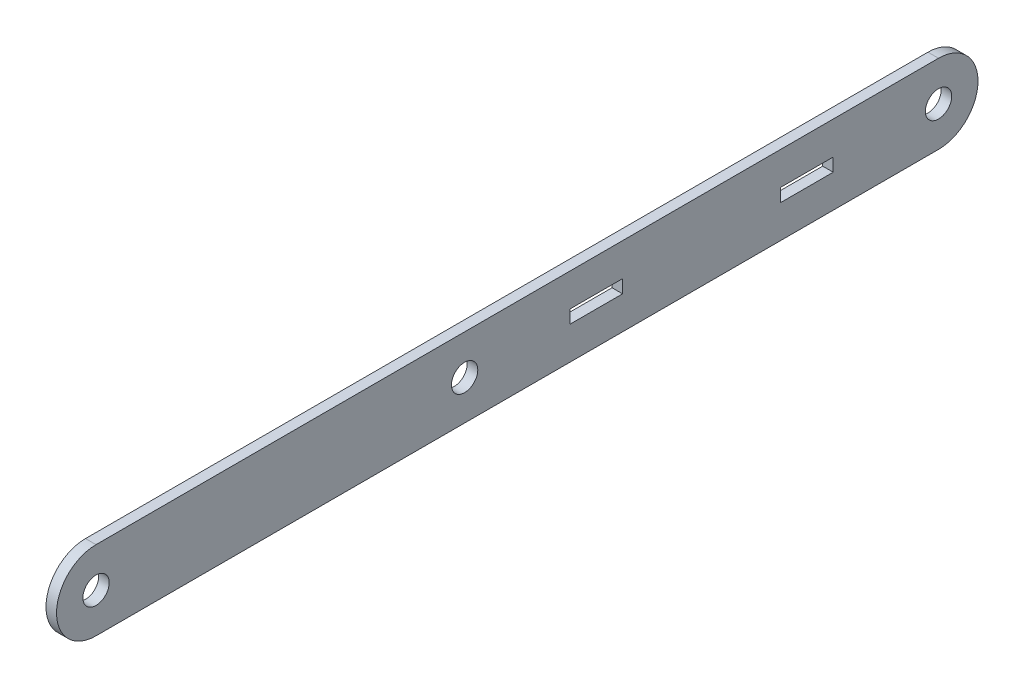
ISO-10303-21;
HEADER;
FILE_DESCRIPTION(('STEP AP214'),'2;1');
FILE_NAME('part.step','',(''),(''),'','','');
FILE_SCHEMA(('AUTOMOTIVE_DESIGN { 1 0 10303 214 1 1 1 1 }'));
ENDSEC;
DATA;
#1=APPLICATION_CONTEXT('core data for automotive mechanical design processes');
#2=APPLICATION_PROTOCOL_DEFINITION('international standard','automotive_design',2000,#1);
#3=PRODUCT_CONTEXT('',#1,'mechanical');
#4=PRODUCT('Part','Part','',(#3));
#5=PRODUCT_RELATED_PRODUCT_CATEGORY('part','',(#4));
#6=PRODUCT_DEFINITION_FORMATION('','',#4);
#7=PRODUCT_DEFINITION_CONTEXT('part definition',#1,'design');
#8=PRODUCT_DEFINITION('design','',#6,#7);
#9=PRODUCT_DEFINITION_SHAPE('','',#8);
#10=(LENGTH_UNIT() NAMED_UNIT(*) SI_UNIT(.MILLI.,.METRE.));
#11=(NAMED_UNIT(*) PLANE_ANGLE_UNIT() SI_UNIT($,.RADIAN.));
#12=(NAMED_UNIT(*) SI_UNIT($,.STERADIAN.) SOLID_ANGLE_UNIT());
#13=UNCERTAINTY_MEASURE_WITH_UNIT(LENGTH_MEASURE(1.E-05),#10,'distance_accuracy_value','');
#14=(GEOMETRIC_REPRESENTATION_CONTEXT(3) GLOBAL_UNCERTAINTY_ASSIGNED_CONTEXT((#13)) GLOBAL_UNIT_ASSIGNED_CONTEXT((#10,
#11,#12)) REPRESENTATION_CONTEXT('',''));
#15=CARTESIAN_POINT('',(0.,0.,0.));
#16=DIRECTION('',(0.,0.,1.));
#17=DIRECTION('',(1.,0.,0.));
#18=AXIS2_PLACEMENT_3D('',#15,#16,#17);
#19=CARTESIAN_POINT('',(2.,0.,80.));
#20=DIRECTION('',(1.,0.,0.));
#21=DIRECTION('',(0.,0.,-1.));
#22=AXIS2_PLACEMENT_3D('',#19,#20,#21);
#23=PLANE('',#22);
#24=CARTESIAN_POINT('',(2.,0.,10.));
#25=DIRECTION('',(1.,0.,0.));
#26=DIRECTION('',(0.,0.,-1.));
#27=AXIS2_PLACEMENT_3D('',#24,#25,#26);
#28=CIRCLE('',#27,2.5);
#29=CARTESIAN_POINT('',(2.,0.,7.50000000000002));
#30=VERTEX_POINT('',#29);
#31=EDGE_CURVE('E160',#30,#30,#28,.T.);
#32=ORIENTED_EDGE('',*,*,#31,.F.);
#33=EDGE_LOOP('',(#32));
#34=FACE_BOUND('',#33,.T.);
#35=CARTESIAN_POINT('',(2.,0.,-80.));
#36=DIRECTION('',(1.,0.,0.));
#37=DIRECTION('',(0.,0.,-1.));
#38=AXIS2_PLACEMENT_3D('',#35,#36,#37);
#39=CIRCLE('',#38,2.50000000000001);
#40=CARTESIAN_POINT('',(2.,0.,-82.5));
#41=VERTEX_POINT('',#40);
#42=EDGE_CURVE('E197',#41,#41,#39,.T.);
#43=ORIENTED_EDGE('',*,*,#42,.F.);
#44=EDGE_LOOP('',(#43));
#45=FACE_BOUND('',#44,.T.);
#46=CARTESIAN_POINT('',(2.,0.,80.));
#47=DIRECTION('',(1.,0.,0.));
#48=DIRECTION('',(0.,0.,-1.));
#49=AXIS2_PLACEMENT_3D('',#46,#47,#48);
#50=CIRCLE('',#49,7.5);
#51=CARTESIAN_POINT('',(2.,7.49999999999999,80.));
#52=VERTEX_POINT('',#51);
#53=CARTESIAN_POINT('',(2.,-7.50000000000001,80.));
#54=VERTEX_POINT('',#53);
#55=EDGE_CURVE('E209',#52,#54,#50,.T.);
#56=ORIENTED_EDGE('',*,*,#55,.T.);
#57=DIRECTION('',(0.,0.,-1.));
#58=VECTOR('',#57,1.);
#59=CARTESIAN_POINT('',(2.,-7.49999999999998,-80.));
#60=LINE('',#59,#58);
#61=CARTESIAN_POINT('',(2.,-7.49999999999998,-80.));
#62=VERTEX_POINT('',#61);
#63=EDGE_CURVE('E212',#54,#62,#60,.T.);
#64=ORIENTED_EDGE('',*,*,#63,.T.);
#65=CARTESIAN_POINT('',(2.,0.,-80.));
#66=DIRECTION('',(1.,0.,0.));
#67=DIRECTION('',(0.,0.,1.));
#68=AXIS2_PLACEMENT_3D('',#65,#66,#67);
#69=CIRCLE('',#68,7.5);
#70=CARTESIAN_POINT('',(2.,7.50000000000002,-80.));
#71=VERTEX_POINT('',#70);
#72=EDGE_CURVE('E215',#62,#71,#69,.T.);
#73=ORIENTED_EDGE('',*,*,#72,.T.);
#74=DIRECTION('',(0.,0.,1.));
#75=VECTOR('',#74,1.);
#76=CARTESIAN_POINT('',(2.,7.50000000000002,-80.));
#77=LINE('',#76,#75);
#78=EDGE_CURVE('E217',#71,#52,#77,.T.);
#79=ORIENTED_EDGE('',*,*,#78,.T.);
#80=EDGE_LOOP('',(#56,#64,#73,#79));
#81=FACE_BOUND('',#80,.T.);
#82=CARTESIAN_POINT('',(2.,0.,80.));
#83=DIRECTION('',(1.,0.,0.));
#84=DIRECTION('',(0.,0.,-1.));
#85=AXIS2_PLACEMENT_3D('',#82,#83,#84);
#86=CIRCLE('',#85,2.50000000000001);
#87=CARTESIAN_POINT('',(2.,0.,77.5));
#88=VERTEX_POINT('',#87);
#89=EDGE_CURVE('E203',#88,#88,#86,.T.);
#90=ORIENTED_EDGE('',*,*,#89,.F.);
#91=EDGE_LOOP('',(#90));
#92=FACE_BOUND('',#91,.T.);
#93=DIRECTION('',(0.,0.,-1.));
#94=VECTOR('',#93,1.);
#95=CARTESIAN_POINT('',(2.,-1.25000000000001,-9.99999999999998));
#96=LINE('',#95,#94);
#97=CARTESIAN_POINT('',(2.,-1.25000000000001,-9.99999999999998));
#98=VERTEX_POINT('',#97);
#99=CARTESIAN_POINT('',(2.,-1.25000000000001,-20.));
#100=VERTEX_POINT('',#99);
#101=EDGE_CURVE('E168',#98,#100,#96,.T.);
#102=ORIENTED_EDGE('',*,*,#101,.F.);
#103=DIRECTION('',(0.,-1.,0.));
#104=VECTOR('',#103,1.);
#105=CARTESIAN_POINT('',(2.,-1.25000000000001,-9.99999999999998));
#106=LINE('',#105,#104);
#107=CARTESIAN_POINT('',(2.,1.24999999999999,-9.99999999999998));
#108=VERTEX_POINT('',#107);
#109=EDGE_CURVE('E166',#108,#98,#106,.T.);
#110=ORIENTED_EDGE('',*,*,#109,.F.);
#111=DIRECTION('',(0.,0.,1.));
#112=VECTOR('',#111,1.);
#113=CARTESIAN_POINT('',(2.,1.24999999999999,-9.99999999999998));
#114=LINE('',#113,#112);
#115=CARTESIAN_POINT('',(2.,1.24999999999999,-20.));
#116=VERTEX_POINT('',#115);
#117=EDGE_CURVE('E174',#116,#108,#114,.T.);
#118=ORIENTED_EDGE('',*,*,#117,.F.);
#119=DIRECTION('',(0.,1.,0.));
#120=VECTOR('',#119,1.);
#121=CARTESIAN_POINT('',(2.,-1.25000000000001,-20.));
#122=LINE('',#121,#120);
#123=EDGE_CURVE('E171',#100,#116,#122,.T.);
#124=ORIENTED_EDGE('',*,*,#123,.F.);
#125=EDGE_LOOP('',(#102,#110,#118,#124));
#126=FACE_BOUND('',#125,.T.);
#127=DIRECTION('',(0.,0.,1.));
#128=VECTOR('',#127,1.);
#129=CARTESIAN_POINT('',(2.,1.24999999999999,-60.));
#130=LINE('',#129,#128);
#131=CARTESIAN_POINT('',(2.,1.24999999999999,-60.));
#132=VERTEX_POINT('',#131);
#133=CARTESIAN_POINT('',(2.,1.24999999999999,-50.));
#134=VERTEX_POINT('',#133);
#135=EDGE_CURVE('E132',#132,#134,#130,.T.);
#136=ORIENTED_EDGE('',*,*,#135,.F.);
#137=DIRECTION('',(0.,1.,0.));
#138=VECTOR('',#137,1.);
#139=CARTESIAN_POINT('',(2.,1.24999999999999,-60.));
#140=LINE('',#139,#138);
#141=CARTESIAN_POINT('',(2.,-1.25000000000001,-60.));
#142=VERTEX_POINT('',#141);
#143=EDGE_CURVE('E124',#142,#132,#140,.T.);
#144=ORIENTED_EDGE('',*,*,#143,.F.);
#145=DIRECTION('',(0.,0.,-1.));
#146=VECTOR('',#145,1.);
#147=CARTESIAN_POINT('',(2.,-1.25000000000001,-60.));
#148=LINE('',#147,#146);
#149=CARTESIAN_POINT('',(2.,-1.25000000000001,-50.));
#150=VERTEX_POINT('',#149);
#151=EDGE_CURVE('E146',#150,#142,#148,.T.);
#152=ORIENTED_EDGE('',*,*,#151,.F.);
#153=DIRECTION('',(0.,-1.,0.));
#154=VECTOR('',#153,1.);
#155=CARTESIAN_POINT('',(2.,1.24999999999999,-50.));
#156=LINE('',#155,#154);
#157=EDGE_CURVE('E144',#134,#150,#156,.T.);
#158=ORIENTED_EDGE('',*,*,#157,.F.);
#159=EDGE_LOOP('',(#136,#144,#152,#158));
#160=FACE_BOUND('',#159,.T.);
#161=ADVANCED_FACE('F35',(#34,#45,#81,#92,#126,#160),#23,.T.);
#162=CARTESIAN_POINT('',(0.,0.,80.));
#163=DIRECTION('',(1.,0.,0.));
#164=DIRECTION('',(0.,0.,-1.));
#165=AXIS2_PLACEMENT_3D('',#162,#163,#164);
#166=PLANE('',#165);
#167=CARTESIAN_POINT('',(0.,0.,10.));
#168=DIRECTION('',(1.,0.,0.));
#169=DIRECTION('',(0.,0.,-1.));
#170=AXIS2_PLACEMENT_3D('',#167,#168,#169);
#171=CIRCLE('',#170,2.5);
#172=CARTESIAN_POINT('',(0.,0.,7.50000000000002));
#173=VERTEX_POINT('',#172);
#174=EDGE_CURVE('E140',#173,#173,#171,.T.);
#175=ORIENTED_EDGE('',*,*,#174,.T.);
#176=EDGE_LOOP('',(#175));
#177=FACE_BOUND('',#176,.T.);
#178=CARTESIAN_POINT('',(0.,0.,-80.));
#179=DIRECTION('',(1.,0.,0.));
#180=DIRECTION('',(0.,0.,-1.));
#181=AXIS2_PLACEMENT_3D('',#178,#179,#180);
#182=CIRCLE('',#181,2.50000000000001);
#183=CARTESIAN_POINT('',(0.,0.,-82.5));
#184=VERTEX_POINT('',#183);
#185=EDGE_CURVE('E196',#184,#184,#182,.T.);
#186=ORIENTED_EDGE('',*,*,#185,.T.);
#187=EDGE_LOOP('',(#186));
#188=FACE_BOUND('',#187,.T.);
#189=CARTESIAN_POINT('',(0.,0.,80.));
#190=DIRECTION('',(1.,0.,0.));
#191=DIRECTION('',(0.,0.,-1.));
#192=AXIS2_PLACEMENT_3D('',#189,#190,#191);
#193=CIRCLE('',#192,7.5);
#194=CARTESIAN_POINT('',(0.,7.49999999999999,80.));
#195=VERTEX_POINT('',#194);
#196=CARTESIAN_POINT('',(0.,-7.50000000000001,80.));
#197=VERTEX_POINT('',#196);
#198=EDGE_CURVE('E206',#195,#197,#193,.T.);
#199=ORIENTED_EDGE('',*,*,#198,.F.);
#200=DIRECTION('',(0.,0.,1.));
#201=VECTOR('',#200,1.);
#202=CARTESIAN_POINT('',(0.,7.50000000000002,-80.));
#203=LINE('',#202,#201);
#204=CARTESIAN_POINT('',(0.,7.50000000000002,-80.));
#205=VERTEX_POINT('',#204);
#206=EDGE_CURVE('E213',#205,#195,#203,.T.);
#207=ORIENTED_EDGE('',*,*,#206,.F.);
#208=CARTESIAN_POINT('',(0.,0.,-80.));
#209=DIRECTION('',(1.,0.,0.));
#210=DIRECTION('',(0.,0.,1.));
#211=AXIS2_PLACEMENT_3D('',#208,#209,#210);
#212=CIRCLE('',#211,7.5);
#213=CARTESIAN_POINT('',(0.,-7.49999999999998,-80.));
#214=VERTEX_POINT('',#213);
#215=EDGE_CURVE('E224',#214,#205,#212,.T.);
#216=ORIENTED_EDGE('',*,*,#215,.F.);
#217=DIRECTION('',(0.,0.,-1.));
#218=VECTOR('',#217,1.);
#219=CARTESIAN_POINT('',(0.,-7.49999999999998,-80.));
#220=LINE('',#219,#218);
#221=EDGE_CURVE('E222',#197,#214,#220,.T.);
#222=ORIENTED_EDGE('',*,*,#221,.F.);
#223=EDGE_LOOP('',(#199,#207,#216,#222));
#224=FACE_BOUND('',#223,.T.);
#225=CARTESIAN_POINT('',(0.,0.,80.));
#226=DIRECTION('',(1.,0.,0.));
#227=DIRECTION('',(0.,0.,-1.));
#228=AXIS2_PLACEMENT_3D('',#225,#226,#227);
#229=CIRCLE('',#228,2.50000000000001);
#230=CARTESIAN_POINT('',(0.,0.,77.5));
#231=VERTEX_POINT('',#230);
#232=EDGE_CURVE('E200',#231,#231,#229,.T.);
#233=ORIENTED_EDGE('',*,*,#232,.T.);
#234=EDGE_LOOP('',(#233));
#235=FACE_BOUND('',#234,.T.);
#236=DIRECTION('',(0.,-1.,0.));
#237=VECTOR('',#236,1.);
#238=CARTESIAN_POINT('',(0.,-1.25000000000001,-9.99999999999998));
#239=LINE('',#238,#237);
#240=CARTESIAN_POINT('',(0.,1.24999999999999,-9.99999999999998));
#241=VERTEX_POINT('',#240);
#242=CARTESIAN_POINT('',(0.,-1.25000000000001,-9.99999999999998));
#243=VERTEX_POINT('',#242);
#244=EDGE_CURVE('E163',#241,#243,#239,.T.);
#245=ORIENTED_EDGE('',*,*,#244,.T.);
#246=DIRECTION('',(0.,0.,-1.));
#247=VECTOR('',#246,1.);
#248=CARTESIAN_POINT('',(0.,-1.25000000000001,-9.99999999999998));
#249=LINE('',#248,#247);
#250=CARTESIAN_POINT('',(0.,-1.25000000000001,-20.));
#251=VERTEX_POINT('',#250);
#252=EDGE_CURVE('E179',#243,#251,#249,.T.);
#253=ORIENTED_EDGE('',*,*,#252,.T.);
#254=DIRECTION('',(0.,1.,0.));
#255=VECTOR('',#254,1.);
#256=CARTESIAN_POINT('',(0.,-1.25000000000001,-20.));
#257=LINE('',#256,#255);
#258=CARTESIAN_POINT('',(0.,1.24999999999999,-20.));
#259=VERTEX_POINT('',#258);
#260=EDGE_CURVE('E182',#251,#259,#257,.T.);
#261=ORIENTED_EDGE('',*,*,#260,.T.);
#262=DIRECTION('',(0.,0.,1.));
#263=VECTOR('',#262,1.);
#264=CARTESIAN_POINT('',(0.,1.24999999999999,-9.99999999999998));
#265=LINE('',#264,#263);
#266=EDGE_CURVE('E169',#259,#241,#265,.T.);
#267=ORIENTED_EDGE('',*,*,#266,.T.);
#268=EDGE_LOOP('',(#245,#253,#261,#267));
#269=FACE_BOUND('',#268,.T.);
#270=DIRECTION('',(0.,1.,0.));
#271=VECTOR('',#270,1.);
#272=CARTESIAN_POINT('',(0.,1.24999999999999,-60.));
#273=LINE('',#272,#271);
#274=CARTESIAN_POINT('',(0.,-1.25000000000001,-60.));
#275=VERTEX_POINT('',#274);
#276=CARTESIAN_POINT('',(0.,1.24999999999999,-60.));
#277=VERTEX_POINT('',#276);
#278=EDGE_CURVE('E58',#275,#277,#273,.T.);
#279=ORIENTED_EDGE('',*,*,#278,.T.);
#280=DIRECTION('',(0.,0.,1.));
#281=VECTOR('',#280,1.);
#282=CARTESIAN_POINT('',(0.,1.24999999999999,-60.));
#283=LINE('',#282,#281);
#284=CARTESIAN_POINT('',(0.,1.24999999999999,-50.));
#285=VERTEX_POINT('',#284);
#286=EDGE_CURVE('E139',#277,#285,#283,.T.);
#287=ORIENTED_EDGE('',*,*,#286,.T.);
#288=DIRECTION('',(0.,-1.,0.));
#289=VECTOR('',#288,1.);
#290=CARTESIAN_POINT('',(0.,1.24999999999999,-50.));
#291=LINE('',#290,#289);
#292=CARTESIAN_POINT('',(0.,-1.25000000000001,-50.));
#293=VERTEX_POINT('',#292);
#294=EDGE_CURVE('E152',#285,#293,#291,.T.);
#295=ORIENTED_EDGE('',*,*,#294,.T.);
#296=DIRECTION('',(0.,0.,-1.));
#297=VECTOR('',#296,1.);
#298=CARTESIAN_POINT('',(0.,-1.25000000000001,-60.));
#299=LINE('',#298,#297);
#300=EDGE_CURVE('E133',#293,#275,#299,.T.);
#301=ORIENTED_EDGE('',*,*,#300,.T.);
#302=EDGE_LOOP('',(#279,#287,#295,#301));
#303=FACE_BOUND('',#302,.T.);
#304=ADVANCED_FACE('F242',(#177,#188,#224,#235,#269,#303),#166,.F.);
#305=CARTESIAN_POINT('',(2.,0.,80.));
#306=DIRECTION('',(-1.,0.,0.));
#307=DIRECTION('',(0.,0.,1.));
#308=AXIS2_PLACEMENT_3D('',#305,#306,#307);
#309=CYLINDRICAL_SURFACE('',#308,7.5);
#310=ORIENTED_EDGE('',*,*,#198,.T.);
#311=DIRECTION('',(-1.,0.,0.));
#312=VECTOR('',#311,1.);
#313=CARTESIAN_POINT('',(2.,-7.50000000000001,80.));
#314=LINE('',#313,#312);
#315=EDGE_CURVE('E11',#54,#197,#314,.T.);
#316=ORIENTED_EDGE('',*,*,#315,.F.);
#317=ORIENTED_EDGE('',*,*,#55,.F.);
#318=DIRECTION('',(-1.,0.,0.));
#319=VECTOR('',#318,1.);
#320=CARTESIAN_POINT('',(2.,7.49999999999999,80.));
#321=LINE('',#320,#319);
#322=EDGE_CURVE('E219',#52,#195,#321,.T.);
#323=ORIENTED_EDGE('',*,*,#322,.T.);
#324=EDGE_LOOP('',(#310,#316,#317,#323));
#325=FACE_BOUND('',#324,.T.);
#326=ADVANCED_FACE('F37',(#325),#309,.T.);
#327=CARTESIAN_POINT('',(2.,-7.49999999999998,-80.));
#328=DIRECTION('',(0.,1.,0.));
#329=DIRECTION('',(0.,0.,1.));
#330=AXIS2_PLACEMENT_3D('',#327,#328,#329);
#331=PLANE('',#330);
#332=ORIENTED_EDGE('',*,*,#221,.T.);
#333=DIRECTION('',(-1.,0.,0.));
#334=VECTOR('',#333,1.);
#335=CARTESIAN_POINT('',(2.,-7.49999999999998,-80.));
#336=LINE('',#335,#334);
#337=EDGE_CURVE('E43',#62,#214,#336,.T.);
#338=ORIENTED_EDGE('',*,*,#337,.F.);
#339=ORIENTED_EDGE('',*,*,#63,.F.);
#340=ORIENTED_EDGE('',*,*,#315,.T.);
#341=EDGE_LOOP('',(#332,#338,#339,#340));
#342=FACE_BOUND('',#341,.T.);
#343=ADVANCED_FACE('F253',(#342),#331,.F.);
#344=CARTESIAN_POINT('',(2.,0.,-80.));
#345=DIRECTION('',(-1.,0.,0.));
#346=DIRECTION('',(0.,0.,1.));
#347=AXIS2_PLACEMENT_3D('',#344,#345,#346);
#348=CYLINDRICAL_SURFACE('',#347,7.5);
#349=ORIENTED_EDGE('',*,*,#215,.T.);
#350=DIRECTION('',(-1.,0.,0.));
#351=VECTOR('',#350,1.);
#352=CARTESIAN_POINT('',(2.,7.50000000000002,-80.));
#353=LINE('',#352,#351);
#354=EDGE_CURVE('E229',#71,#205,#353,.T.);
#355=ORIENTED_EDGE('',*,*,#354,.F.);
#356=ORIENTED_EDGE('',*,*,#72,.F.);
#357=ORIENTED_EDGE('',*,*,#337,.T.);
#358=EDGE_LOOP('',(#349,#355,#356,#357));
#359=FACE_BOUND('',#358,.T.);
#360=ADVANCED_FACE('F236',(#359),#348,.T.);
#361=CARTESIAN_POINT('',(2.,7.50000000000002,-80.));
#362=DIRECTION('',(0.,-1.,0.));
#363=DIRECTION('',(0.,0.,-1.));
#364=AXIS2_PLACEMENT_3D('',#361,#362,#363);
#365=PLANE('',#364);
#366=ORIENTED_EDGE('',*,*,#206,.T.);
#367=ORIENTED_EDGE('',*,*,#322,.F.);
#368=ORIENTED_EDGE('',*,*,#78,.F.);
#369=ORIENTED_EDGE('',*,*,#354,.T.);
#370=EDGE_LOOP('',(#366,#367,#368,#369));
#371=FACE_BOUND('',#370,.T.);
#372=ADVANCED_FACE('F246',(#371),#365,.F.);
#373=CARTESIAN_POINT('',(2.,0.,80.));
#374=DIRECTION('',(-1.,0.,0.));
#375=DIRECTION('',(0.,0.,1.));
#376=AXIS2_PLACEMENT_3D('',#373,#374,#375);
#377=CYLINDRICAL_SURFACE('',#376,2.50000000000001);
#378=ORIENTED_EDGE('',*,*,#89,.T.);
#379=EDGE_LOOP('',(#378));
#380=FACE_BOUND('',#379,.T.);
#381=ORIENTED_EDGE('',*,*,#232,.F.);
#382=EDGE_LOOP('',(#381));
#383=FACE_BOUND('',#382,.T.);
#384=ADVANCED_FACE('F271',(#380,#383),#377,.F.);
#385=CARTESIAN_POINT('',(2.,0.,-80.));
#386=DIRECTION('',(-1.,0.,0.));
#387=DIRECTION('',(0.,0.,1.));
#388=AXIS2_PLACEMENT_3D('',#385,#386,#387);
#389=CYLINDRICAL_SURFACE('',#388,2.50000000000001);
#390=ORIENTED_EDGE('',*,*,#42,.T.);
#391=EDGE_LOOP('',(#390));
#392=FACE_BOUND('',#391,.T.);
#393=ORIENTED_EDGE('',*,*,#185,.F.);
#394=EDGE_LOOP('',(#393));
#395=FACE_BOUND('',#394,.T.);
#396=ADVANCED_FACE('F278',(#392,#395),#389,.F.);
#397=CARTESIAN_POINT('',(2.,-1.25000000000001,-9.99999999999998));
#398=DIRECTION('',(0.,0.,-1.));
#399=DIRECTION('',(-1.,0.,0.));
#400=AXIS2_PLACEMENT_3D('',#397,#398,#399);
#401=PLANE('',#400);
#402=ORIENTED_EDGE('',*,*,#244,.F.);
#403=DIRECTION('',(-1.,0.,0.));
#404=VECTOR('',#403,1.);
#405=CARTESIAN_POINT('',(2.,1.24999999999999,-9.99999999999998));
#406=LINE('',#405,#404);
#407=EDGE_CURVE('E176',#108,#241,#406,.T.);
#408=ORIENTED_EDGE('',*,*,#407,.F.);
#409=ORIENTED_EDGE('',*,*,#109,.T.);
#410=DIRECTION('',(-1.,0.,0.));
#411=VECTOR('',#410,1.);
#412=CARTESIAN_POINT('',(2.,-1.25000000000001,-9.99999999999998));
#413=LINE('',#412,#411);
#414=EDGE_CURVE('E193',#98,#243,#413,.T.);
#415=ORIENTED_EDGE('',*,*,#414,.T.);
#416=EDGE_LOOP('',(#402,#408,#409,#415));
#417=FACE_BOUND('',#416,.T.);
#418=ADVANCED_FACE('F283',(#417),#401,.T.);
#419=CARTESIAN_POINT('',(2.,-1.25000000000001,-9.99999999999998));
#420=DIRECTION('',(0.,1.,0.));
#421=DIRECTION('',(0.,0.,1.));
#422=AXIS2_PLACEMENT_3D('',#419,#420,#421);
#423=PLANE('',#422);
#424=ORIENTED_EDGE('',*,*,#252,.F.);
#425=ORIENTED_EDGE('',*,*,#414,.F.);
#426=ORIENTED_EDGE('',*,*,#101,.T.);
#427=DIRECTION('',(-1.,0.,0.));
#428=VECTOR('',#427,1.);
#429=CARTESIAN_POINT('',(2.,-1.25000000000001,-20.));
#430=LINE('',#429,#428);
#431=EDGE_CURVE('E191',#100,#251,#430,.T.);
#432=ORIENTED_EDGE('',*,*,#431,.T.);
#433=EDGE_LOOP('',(#424,#425,#426,#432));
#434=FACE_BOUND('',#433,.T.);
#435=ADVANCED_FACE('F316',(#434),#423,.T.);
#436=CARTESIAN_POINT('',(2.,-1.25000000000001,-20.));
#437=DIRECTION('',(0.,0.,1.));
#438=DIRECTION('',(1.,0.,0.));
#439=AXIS2_PLACEMENT_3D('',#436,#437,#438);
#440=PLANE('',#439);
#441=ORIENTED_EDGE('',*,*,#260,.F.);
#442=ORIENTED_EDGE('',*,*,#431,.F.);
#443=ORIENTED_EDGE('',*,*,#123,.T.);
#444=DIRECTION('',(-1.,0.,0.));
#445=VECTOR('',#444,1.);
#446=CARTESIAN_POINT('',(2.,1.24999999999999,-20.));
#447=LINE('',#446,#445);
#448=EDGE_CURVE('E189',#116,#259,#447,.T.);
#449=ORIENTED_EDGE('',*,*,#448,.T.);
#450=EDGE_LOOP('',(#441,#442,#443,#449));
#451=FACE_BOUND('',#450,.T.);
#452=ADVANCED_FACE('F312',(#451),#440,.T.);
#453=CARTESIAN_POINT('',(2.,1.24999999999999,-9.99999999999998));
#454=DIRECTION('',(0.,-1.,0.));
#455=DIRECTION('',(0.,0.,-1.));
#456=AXIS2_PLACEMENT_3D('',#453,#454,#455);
#457=PLANE('',#456);
#458=ORIENTED_EDGE('',*,*,#266,.F.);
#459=ORIENTED_EDGE('',*,*,#448,.F.);
#460=ORIENTED_EDGE('',*,*,#117,.T.);
#461=ORIENTED_EDGE('',*,*,#407,.T.);
#462=EDGE_LOOP('',(#458,#459,#460,#461));
#463=FACE_BOUND('',#462,.T.);
#464=ADVANCED_FACE('F308',(#463),#457,.T.);
#465=CARTESIAN_POINT('',(2.,0.,10.));
#466=DIRECTION('',(-1.,0.,0.));
#467=DIRECTION('',(0.,0.,1.));
#468=AXIS2_PLACEMENT_3D('',#465,#466,#467);
#469=CYLINDRICAL_SURFACE('',#468,2.5);
#470=ORIENTED_EDGE('',*,*,#31,.T.);
#471=EDGE_LOOP('',(#470));
#472=FACE_BOUND('',#471,.T.);
#473=ORIENTED_EDGE('',*,*,#174,.F.);
#474=EDGE_LOOP('',(#473));
#475=FACE_BOUND('',#474,.T.);
#476=ADVANCED_FACE('F305',(#472,#475),#469,.F.);
#477=CARTESIAN_POINT('',(2.,1.24999999999999,-60.));
#478=DIRECTION('',(0.,0.,1.));
#479=DIRECTION('',(1.,0.,0.));
#480=AXIS2_PLACEMENT_3D('',#477,#478,#479);
#481=PLANE('',#480);
#482=ORIENTED_EDGE('',*,*,#278,.F.);
#483=DIRECTION('',(-1.,0.,0.));
#484=VECTOR('',#483,1.);
#485=CARTESIAN_POINT('',(2.,-1.25000000000001,-60.));
#486=LINE('',#485,#484);
#487=EDGE_CURVE('E128',#142,#275,#486,.T.);
#488=ORIENTED_EDGE('',*,*,#487,.F.);
#489=ORIENTED_EDGE('',*,*,#143,.T.);
#490=DIRECTION('',(-1.,0.,0.));
#491=VECTOR('',#490,1.);
#492=CARTESIAN_POINT('',(2.,1.24999999999999,-60.));
#493=LINE('',#492,#491);
#494=EDGE_CURVE('E127',#132,#277,#493,.T.);
#495=ORIENTED_EDGE('',*,*,#494,.T.);
#496=EDGE_LOOP('',(#482,#488,#489,#495));
#497=FACE_BOUND('',#496,.T.);
#498=ADVANCED_FACE('F126',(#497),#481,.T.);
#499=CARTESIAN_POINT('',(2.,1.24999999999999,-60.));
#500=DIRECTION('',(0.,-1.,0.));
#501=DIRECTION('',(0.,0.,-1.));
#502=AXIS2_PLACEMENT_3D('',#499,#500,#501);
#503=PLANE('',#502);
#504=ORIENTED_EDGE('',*,*,#286,.F.);
#505=ORIENTED_EDGE('',*,*,#494,.F.);
#506=ORIENTED_EDGE('',*,*,#135,.T.);
#507=DIRECTION('',(-1.,0.,0.));
#508=VECTOR('',#507,1.);
#509=CARTESIAN_POINT('',(2.,1.24999999999999,-50.));
#510=LINE('',#509,#508);
#511=EDGE_CURVE('E141',#134,#285,#510,.T.);
#512=ORIENTED_EDGE('',*,*,#511,.T.);
#513=EDGE_LOOP('',(#504,#505,#506,#512));
#514=FACE_BOUND('',#513,.T.);
#515=ADVANCED_FACE('F136',(#514),#503,.T.);
#516=CARTESIAN_POINT('',(2.,1.24999999999999,-50.));
#517=DIRECTION('',(0.,0.,-1.));
#518=DIRECTION('',(-1.,0.,0.));
#519=AXIS2_PLACEMENT_3D('',#516,#517,#518);
#520=PLANE('',#519);
#521=ORIENTED_EDGE('',*,*,#294,.F.);
#522=ORIENTED_EDGE('',*,*,#511,.F.);
#523=ORIENTED_EDGE('',*,*,#157,.T.);
#524=DIRECTION('',(-1.,0.,0.));
#525=VECTOR('',#524,1.);
#526=CARTESIAN_POINT('',(2.,-1.25000000000001,-50.));
#527=LINE('',#526,#525);
#528=EDGE_CURVE('E50',#150,#293,#527,.T.);
#529=ORIENTED_EDGE('',*,*,#528,.T.);
#530=EDGE_LOOP('',(#521,#522,#523,#529));
#531=FACE_BOUND('',#530,.T.);
#532=ADVANCED_FACE('F293',(#531),#520,.T.);
#533=CARTESIAN_POINT('',(2.,-1.25000000000001,-60.));
#534=DIRECTION('',(0.,1.,0.));
#535=DIRECTION('',(0.,0.,1.));
#536=AXIS2_PLACEMENT_3D('',#533,#534,#535);
#537=PLANE('',#536);
#538=ORIENTED_EDGE('',*,*,#300,.F.);
#539=ORIENTED_EDGE('',*,*,#528,.F.);
#540=ORIENTED_EDGE('',*,*,#151,.T.);
#541=ORIENTED_EDGE('',*,*,#487,.T.);
#542=EDGE_LOOP('',(#538,#539,#540,#541));
#543=FACE_BOUND('',#542,.T.);
#544=ADVANCED_FACE('F291',(#543),#537,.T.);
#545=CLOSED_SHELL('',(#161,#304,#326,#343,#360,#372,#384,#396,#418,#435,#452,#464,#476,#498,
#515,#532,#544));
#546=MANIFOLD_SOLID_BREP('B2',#545);
#547=ADVANCED_BREP_SHAPE_REPRESENTATION('',(#18,#546),#14);
#548=SHAPE_DEFINITION_REPRESENTATION(#9,#547);
ENDSEC;
END-ISO-10303-21;
